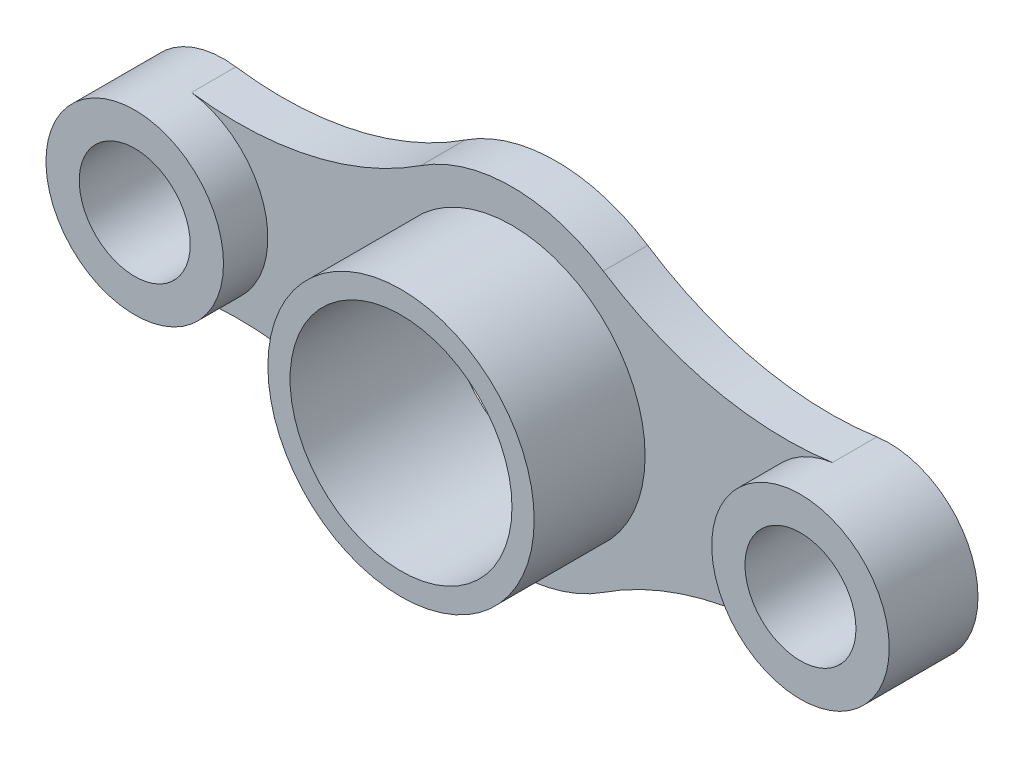
ISO-10303-21;
HEADER;
FILE_DESCRIPTION(('STEP AP214'),'2;1');
FILE_NAME('part.step','',(''),(''),'','','');
FILE_SCHEMA(('AUTOMOTIVE_DESIGN { 1 0 10303 214 1 1 1 1 }'));
ENDSEC;
DATA;
#1=APPLICATION_CONTEXT('core data for automotive mechanical design processes');
#2=APPLICATION_PROTOCOL_DEFINITION('international standard','automotive_design',2000,#1);
#3=PRODUCT_CONTEXT('',#1,'mechanical');
#4=PRODUCT('Part','Part','',(#3));
#5=PRODUCT_RELATED_PRODUCT_CATEGORY('part','',(#4));
#6=PRODUCT_DEFINITION_FORMATION('','',#4);
#7=PRODUCT_DEFINITION_CONTEXT('part definition',#1,'design');
#8=PRODUCT_DEFINITION('design','',#6,#7);
#9=PRODUCT_DEFINITION_SHAPE('','',#8);
#10=(LENGTH_UNIT() NAMED_UNIT(*) SI_UNIT(.MILLI.,.METRE.));
#11=(NAMED_UNIT(*) PLANE_ANGLE_UNIT() SI_UNIT($,.RADIAN.));
#12=(NAMED_UNIT(*) SI_UNIT($,.STERADIAN.) SOLID_ANGLE_UNIT());
#13=UNCERTAINTY_MEASURE_WITH_UNIT(LENGTH_MEASURE(1.E-05),#10,'distance_accuracy_value','');
#14=(GEOMETRIC_REPRESENTATION_CONTEXT(3) GLOBAL_UNCERTAINTY_ASSIGNED_CONTEXT((#13)) GLOBAL_UNIT_ASSIGNED_CONTEXT((#10,
#11,#12)) REPRESENTATION_CONTEXT('',''));
#15=CARTESIAN_POINT('',(0.,0.,0.));
#16=DIRECTION('',(0.,0.,1.));
#17=DIRECTION('',(1.,0.,0.));
#18=AXIS2_PLACEMENT_3D('',#15,#16,#17);
#19=CARTESIAN_POINT('',(123.416666666667,-188.131141464907,20.));
#20=DIRECTION('',(0.,0.,-1.));
#21=DIRECTION('',(-1.,0.,0.));
#22=AXIS2_PLACEMENT_3D('',#19,#20,#21);
#23=CYLINDRICAL_SURFACE('',#22,150.);
#24=CARTESIAN_POINT('',(123.416666666667,-188.131141464907,0.));
#25=DIRECTION('',(0.,0.,1.));
#26=DIRECTION('',(1.,0.,0.));
#27=AXIS2_PLACEMENT_3D('',#24,#25,#26);
#28=CIRCLE('',#27,150.);
#29=CARTESIAN_POINT('',(144.40350877193,-39.6065560978751,0.));
#30=VERTEX_POINT('',#29);
#31=CARTESIAN_POINT('',(41.1388888888889,-62.7103804883024,0.));
#32=VERTEX_POINT('',#31);
#33=EDGE_CURVE('E130',#30,#32,#28,.T.);
#34=ORIENTED_EDGE('',*,*,#33,.F.);
#35=DIRECTION('',(0.,0.,-1.));
#36=VECTOR('',#35,1.);
#37=CARTESIAN_POINT('',(144.40350877193,-39.6065560978751,20.));
#38=LINE('',#37,#36);
#39=CARTESIAN_POINT('',(144.40350877193,-39.6065560978751,20.));
#40=VERTEX_POINT('',#39);
#41=EDGE_CURVE('E11',#40,#30,#38,.T.);
#42=ORIENTED_EDGE('',*,*,#41,.F.);
#43=CARTESIAN_POINT('',(123.416666666667,-188.131141464907,20.));
#44=DIRECTION('',(0.,0.,1.));
#45=DIRECTION('',(1.,0.,0.));
#46=AXIS2_PLACEMENT_3D('',#43,#44,#45);
#47=CIRCLE('',#46,150.);
#48=CARTESIAN_POINT('',(41.1388888888889,-62.7103804883024,20.));
#49=VERTEX_POINT('',#48);
#50=EDGE_CURVE('E199',#40,#49,#47,.T.);
#51=ORIENTED_EDGE('',*,*,#50,.T.);
#52=DIRECTION('',(0.,0.,-1.));
#53=VECTOR('',#52,1.);
#54=CARTESIAN_POINT('',(41.1388888888889,-62.7103804883024,20.));
#55=LINE('',#54,#53);
#56=EDGE_CURVE('E81',#49,#32,#55,.T.);
#57=ORIENTED_EDGE('',*,*,#56,.T.);
#58=EDGE_LOOP('',(#34,#42,#51,#57));
#59=FACE_BOUND('',#58,.T.);
#60=ADVANCED_FACE('F35',(#59),#23,.F.);
#61=CARTESIAN_POINT('',(123.416666666667,188.131141464907,20.));
#62=DIRECTION('',(0.,0.,-1.));
#63=DIRECTION('',(-1.,0.,0.));
#64=AXIS2_PLACEMENT_3D('',#61,#62,#63);
#65=CYLINDRICAL_SURFACE('',#64,150.);
#66=CARTESIAN_POINT('',(123.416666666667,188.131141464907,0.));
#67=DIRECTION('',(0.,0.,1.));
#68=DIRECTION('',(1.,0.,0.));
#69=AXIS2_PLACEMENT_3D('',#66,#67,#68);
#70=CIRCLE('',#69,150.);
#71=CARTESIAN_POINT('',(144.40350877193,39.6065560978752,0.));
#72=VERTEX_POINT('',#71);
#73=CARTESIAN_POINT('',(41.1388888888889,62.7103804883023,0.));
#74=VERTEX_POINT('',#73);
#75=EDGE_CURVE('E132',#72,#74,#70,.F.);
#76=ORIENTED_EDGE('',*,*,#75,.T.);
#77=DIRECTION('',(0.,0.,-1.));
#78=VECTOR('',#77,1.);
#79=CARTESIAN_POINT('',(41.1388888888889,62.7103804883023,20.));
#80=LINE('',#79,#78);
#81=CARTESIAN_POINT('',(41.1388888888889,62.7103804883023,20.));
#82=VERTEX_POINT('',#81);
#83=EDGE_CURVE('E115',#82,#74,#80,.T.);
#84=ORIENTED_EDGE('',*,*,#83,.F.);
#85=CARTESIAN_POINT('',(123.416666666667,188.131141464907,20.));
#86=DIRECTION('',(0.,0.,1.));
#87=DIRECTION('',(1.,0.,0.));
#88=AXIS2_PLACEMENT_3D('',#85,#86,#87);
#89=CIRCLE('',#88,150.);
#90=CARTESIAN_POINT('',(144.40350877193,39.6065560978751,20.));
#91=VERTEX_POINT('',#90);
#92=EDGE_CURVE('E103',#91,#82,#89,.F.);
#93=ORIENTED_EDGE('',*,*,#92,.F.);
#94=DIRECTION('',(0.,0.,-1.));
#95=VECTOR('',#94,1.);
#96=CARTESIAN_POINT('',(144.40350877193,39.6065560978751,20.));
#97=LINE('',#96,#95);
#98=EDGE_CURVE('E43',#91,#72,#97,.T.);
#99=ORIENTED_EDGE('',*,*,#98,.T.);
#100=EDGE_LOOP('',(#76,#84,#93,#99));
#101=FACE_BOUND('',#100,.T.);
#102=ADVANCED_FACE('F156',(#101),#65,.F.);
#103=CARTESIAN_POINT('',(0.,0.,20.));
#104=DIRECTION('',(0.,0.,-1.));
#105=DIRECTION('',(-1.,0.,0.));
#106=AXIS2_PLACEMENT_3D('',#103,#104,#105);
#107=CYLINDRICAL_SURFACE('',#106,74.9999999999999);
#108=CARTESIAN_POINT('',(0.,0.,0.));
#109=DIRECTION('',(0.,0.,1.));
#110=DIRECTION('',(1.,0.,0.));
#111=AXIS2_PLACEMENT_3D('',#108,#109,#110);
#112=CIRCLE('',#111,74.9999999999999);
#113=CARTESIAN_POINT('',(-41.1388888888889,62.7103804883023,0.));
#114=VERTEX_POINT('',#113);
#115=EDGE_CURVE('E111',#74,#114,#112,.T.);
#116=ORIENTED_EDGE('',*,*,#115,.T.);
#117=DIRECTION('',(0.,0.,-1.));
#118=VECTOR('',#117,1.);
#119=CARTESIAN_POINT('',(-41.1388888888889,62.7103804883023,20.));
#120=LINE('',#119,#118);
#121=CARTESIAN_POINT('',(-41.1388888888889,62.7103804883023,20.));
#122=VERTEX_POINT('',#121);
#123=EDGE_CURVE('E109',#122,#114,#120,.T.);
#124=ORIENTED_EDGE('',*,*,#123,.F.);
#125=CARTESIAN_POINT('',(0.,0.,20.));
#126=DIRECTION('',(0.,0.,1.));
#127=DIRECTION('',(1.,0.,0.));
#128=AXIS2_PLACEMENT_3D('',#125,#126,#127);
#129=CIRCLE('',#128,74.9999999999999);
#130=EDGE_CURVE('E95',#82,#122,#129,.T.);
#131=ORIENTED_EDGE('',*,*,#130,.F.);
#132=ORIENTED_EDGE('',*,*,#83,.T.);
#133=EDGE_LOOP('',(#116,#124,#131,#132));
#134=FACE_BOUND('',#133,.T.);
#135=ADVANCED_FACE('F110',(#134),#107,.T.);
#136=CARTESIAN_POINT('',(-123.416666666667,188.131141464907,20.));
#137=DIRECTION('',(0.,0.,-1.));
#138=DIRECTION('',(-1.,0.,0.));
#139=AXIS2_PLACEMENT_3D('',#136,#137,#138);
#140=CYLINDRICAL_SURFACE('',#139,150.);
#141=CARTESIAN_POINT('',(-123.416666666667,188.131141464907,0.));
#142=DIRECTION('',(0.,0.,1.));
#143=DIRECTION('',(1.,0.,0.));
#144=AXIS2_PLACEMENT_3D('',#141,#142,#143);
#145=CIRCLE('',#144,150.);
#146=CARTESIAN_POINT('',(-144.40350877193,39.6065560978751,0.));
#147=VERTEX_POINT('',#146);
#148=EDGE_CURVE('E137',#147,#114,#145,.T.);
#149=ORIENTED_EDGE('',*,*,#148,.F.);
#150=DIRECTION('',(0.,0.,-1.));
#151=VECTOR('',#150,1.);
#152=CARTESIAN_POINT('',(-144.40350877193,39.6065560978751,20.));
#153=LINE('',#152,#151);
#154=CARTESIAN_POINT('',(-144.40350877193,39.6065560978751,20.));
#155=VERTEX_POINT('',#154);
#156=EDGE_CURVE('E116',#155,#147,#153,.T.);
#157=ORIENTED_EDGE('',*,*,#156,.F.);
#158=CARTESIAN_POINT('',(-123.416666666667,188.131141464907,20.));
#159=DIRECTION('',(0.,0.,1.));
#160=DIRECTION('',(1.,0.,0.));
#161=AXIS2_PLACEMENT_3D('',#158,#159,#160);
#162=CIRCLE('',#161,150.);
#163=EDGE_CURVE('E101',#155,#122,#162,.T.);
#164=ORIENTED_EDGE('',*,*,#163,.T.);
#165=ORIENTED_EDGE('',*,*,#123,.T.);
#166=EDGE_LOOP('',(#149,#157,#164,#165));
#167=FACE_BOUND('',#166,.T.);
#168=ADVANCED_FACE('F119',(#167),#140,.F.);
#169=CARTESIAN_POINT('',(-123.416666666667,-188.131141464907,20.));
#170=DIRECTION('',(0.,0.,-1.));
#171=DIRECTION('',(-1.,0.,0.));
#172=AXIS2_PLACEMENT_3D('',#169,#170,#171);
#173=CYLINDRICAL_SURFACE('',#172,150.);
#174=CARTESIAN_POINT('',(-123.416666666667,-188.131141464907,0.));
#175=DIRECTION('',(0.,0.,1.));
#176=DIRECTION('',(1.,0.,0.));
#177=AXIS2_PLACEMENT_3D('',#174,#175,#176);
#178=CIRCLE('',#177,150.);
#179=CARTESIAN_POINT('',(-144.40350877193,-39.606556097875,0.));
#180=VERTEX_POINT('',#179);
#181=CARTESIAN_POINT('',(-41.1388888888889,-62.7103804883023,0.));
#182=VERTEX_POINT('',#181);
#183=EDGE_CURVE('E139',#180,#182,#178,.F.);
#184=ORIENTED_EDGE('',*,*,#183,.T.);
#185=DIRECTION('',(0.,0.,-1.));
#186=VECTOR('',#185,1.);
#187=CARTESIAN_POINT('',(-41.1388888888889,-62.7103804883023,20.));
#188=LINE('',#187,#186);
#189=CARTESIAN_POINT('',(-41.1388888888889,-62.7103804883023,20.));
#190=VERTEX_POINT('',#189);
#191=EDGE_CURVE('E145',#190,#182,#188,.T.);
#192=ORIENTED_EDGE('',*,*,#191,.F.);
#193=CARTESIAN_POINT('',(-123.416666666667,-188.131141464907,20.));
#194=DIRECTION('',(0.,0.,1.));
#195=DIRECTION('',(1.,0.,0.));
#196=AXIS2_PLACEMENT_3D('',#193,#194,#195);
#197=CIRCLE('',#196,150.);
#198=CARTESIAN_POINT('',(-144.40350877193,-39.6065560978751,20.));
#199=VERTEX_POINT('',#198);
#200=EDGE_CURVE('E124',#199,#190,#197,.F.);
#201=ORIENTED_EDGE('',*,*,#200,.F.);
#202=DIRECTION('',(0.,0.,-1.));
#203=VECTOR('',#202,1.);
#204=CARTESIAN_POINT('',(-144.40350877193,-39.6065560978751,20.));
#205=LINE('',#204,#203);
#206=EDGE_CURVE('E147',#199,#180,#205,.T.);
#207=ORIENTED_EDGE('',*,*,#206,.T.);
#208=EDGE_LOOP('',(#184,#192,#201,#207));
#209=FACE_BOUND('',#208,.T.);
#210=ADVANCED_FACE('F213',(#209),#173,.F.);
#211=CARTESIAN_POINT('',(0.,0.,20.));
#212=DIRECTION('',(0.,0.,-1.));
#213=DIRECTION('',(-1.,0.,0.));
#214=AXIS2_PLACEMENT_3D('',#211,#212,#213);
#215=CYLINDRICAL_SURFACE('',#214,75.);
#216=CARTESIAN_POINT('',(0.,0.,0.));
#217=DIRECTION('',(0.,0.,1.));
#218=DIRECTION('',(1.,0.,0.));
#219=AXIS2_PLACEMENT_3D('',#216,#217,#218);
#220=CIRCLE('',#219,75.);
#221=EDGE_CURVE('E75',#182,#32,#220,.T.);
#222=ORIENTED_EDGE('',*,*,#221,.T.);
#223=ORIENTED_EDGE('',*,*,#56,.F.);
#224=CARTESIAN_POINT('',(0.,0.,20.));
#225=DIRECTION('',(0.,0.,1.));
#226=DIRECTION('',(1.,0.,0.));
#227=AXIS2_PLACEMENT_3D('',#224,#225,#226);
#228=CIRCLE('',#227,75.);
#229=EDGE_CURVE('E51',#190,#49,#228,.T.);
#230=ORIENTED_EDGE('',*,*,#229,.F.);
#231=ORIENTED_EDGE('',*,*,#191,.T.);
#232=EDGE_LOOP('',(#222,#223,#230,#231));
#233=FACE_BOUND('',#232,.T.);
#234=ADVANCED_FACE('F216',(#233),#215,.T.);
#235=CARTESIAN_POINT('',(0.,0.,20.));
#236=DIRECTION('',(0.,0.,1.));
#237=DIRECTION('',(1.,0.,0.));
#238=AXIS2_PLACEMENT_3D('',#235,#236,#237);
#239=PLANE('',#238);
#240=CARTESIAN_POINT('',(0.,0.,20.));
#241=DIRECTION('',(0.,0.,1.));
#242=DIRECTION('',(1.,0.,0.));
#243=AXIS2_PLACEMENT_3D('',#240,#241,#242);
#244=CIRCLE('',#243,60.);
#245=CARTESIAN_POINT('',(60.,0.,20.));
#246=VERTEX_POINT('',#245);
#247=EDGE_CURVE('E143',#246,#246,#244,.T.);
#248=ORIENTED_EDGE('',*,*,#247,.F.);
#249=EDGE_LOOP('',(#248));
#250=FACE_BOUND('',#249,.T.);
#251=ORIENTED_EDGE('',*,*,#50,.F.);
#252=CARTESIAN_POINT('',(150.,0.,20.));
#253=DIRECTION('',(0.,0.,1.));
#254=DIRECTION('',(1.,0.,0.));
#255=AXIS2_PLACEMENT_3D('',#252,#253,#254);
#256=CIRCLE('',#255,40.);
#257=EDGE_CURVE('E201',#40,#91,#256,.F.);
#258=ORIENTED_EDGE('',*,*,#257,.T.);
#259=ORIENTED_EDGE('',*,*,#92,.T.);
#260=ORIENTED_EDGE('',*,*,#130,.T.);
#261=ORIENTED_EDGE('',*,*,#163,.F.);
#262=CARTESIAN_POINT('',(-150.,0.,20.));
#263=DIRECTION('',(0.,0.,1.));
#264=DIRECTION('',(1.,0.,0.));
#265=AXIS2_PLACEMENT_3D('',#262,#263,#264);
#266=CIRCLE('',#265,40.);
#267=EDGE_CURVE('E121',#199,#155,#266,.T.);
#268=ORIENTED_EDGE('',*,*,#267,.F.);
#269=ORIENTED_EDGE('',*,*,#200,.T.);
#270=ORIENTED_EDGE('',*,*,#229,.T.);
#271=EDGE_LOOP('',(#251,#258,#259,#260,#261,#268,#269,#270));
#272=FACE_BOUND('',#271,.T.);
#273=ADVANCED_FACE('F97',(#250,#272),#239,.T.);
#274=CARTESIAN_POINT('',(0.,0.,0.));
#275=DIRECTION('',(0.,0.,1.));
#276=DIRECTION('',(1.,0.,0.));
#277=AXIS2_PLACEMENT_3D('',#274,#275,#276);
#278=PLANE('',#277);
#279=ORIENTED_EDGE('',*,*,#33,.T.);
#280=ORIENTED_EDGE('',*,*,#221,.F.);
#281=ORIENTED_EDGE('',*,*,#183,.F.);
#282=CARTESIAN_POINT('',(-150.,0.,0.));
#283=DIRECTION('',(0.,0.,1.));
#284=DIRECTION('',(1.,0.,0.));
#285=AXIS2_PLACEMENT_3D('',#282,#283,#284);
#286=CIRCLE('',#285,39.9999999999999);
#287=EDGE_CURVE('E181',#147,#180,#286,.T.);
#288=ORIENTED_EDGE('',*,*,#287,.F.);
#289=ORIENTED_EDGE('',*,*,#148,.T.);
#290=ORIENTED_EDGE('',*,*,#115,.F.);
#291=ORIENTED_EDGE('',*,*,#75,.F.);
#292=CARTESIAN_POINT('',(150.,0.,0.));
#293=DIRECTION('',(0.,0.,1.));
#294=DIRECTION('',(1.,0.,0.));
#295=AXIS2_PLACEMENT_3D('',#292,#293,#294);
#296=CIRCLE('',#295,40.);
#297=EDGE_CURVE('E165',#72,#30,#296,.F.);
#298=ORIENTED_EDGE('',*,*,#297,.T.);
#299=EDGE_LOOP('',(#279,#280,#281,#288,#289,#290,#291,#298));
#300=FACE_BOUND('',#299,.T.);
#301=CARTESIAN_POINT('',(0.,0.,0.));
#302=DIRECTION('',(0.,0.,1.));
#303=DIRECTION('',(1.,0.,0.));
#304=AXIS2_PLACEMENT_3D('',#301,#302,#303);
#305=CIRCLE('',#304,50.);
#306=CARTESIAN_POINT('',(50.,0.,0.));
#307=VERTEX_POINT('',#306);
#308=EDGE_CURVE('E184',#307,#307,#305,.T.);
#309=ORIENTED_EDGE('',*,*,#308,.T.);
#310=EDGE_LOOP('',(#309));
#311=FACE_BOUND('',#310,.T.);
#312=CARTESIAN_POINT('',(-150.,0.,0.));
#313=DIRECTION('',(0.,0.,1.));
#314=DIRECTION('',(1.,0.,0.));
#315=AXIS2_PLACEMENT_3D('',#312,#313,#314);
#316=CIRCLE('',#315,25.);
#317=CARTESIAN_POINT('',(-125.,0.,0.));
#318=VERTEX_POINT('',#317);
#319=EDGE_CURVE('E185',#318,#318,#316,.T.);
#320=ORIENTED_EDGE('',*,*,#319,.T.);
#321=EDGE_LOOP('',(#320));
#322=FACE_BOUND('',#321,.T.);
#323=CARTESIAN_POINT('',(150.,0.,0.));
#324=DIRECTION('',(0.,0.,1.));
#325=DIRECTION('',(1.,0.,0.));
#326=AXIS2_PLACEMENT_3D('',#323,#324,#325);
#327=CIRCLE('',#326,25.);
#328=CARTESIAN_POINT('',(175.,0.,0.));
#329=VERTEX_POINT('',#328);
#330=EDGE_CURVE('E168',#329,#329,#327,.F.);
#331=ORIENTED_EDGE('',*,*,#330,.F.);
#332=EDGE_LOOP('',(#331));
#333=FACE_BOUND('',#332,.T.);
#334=ADVANCED_FACE('F163',(#300,#311,#322,#333),#278,.F.);
#335=CARTESIAN_POINT('',(0.,0.,70.));
#336=DIRECTION('',(0.,0.,-1.));
#337=DIRECTION('',(-1.,0.,0.));
#338=AXIS2_PLACEMENT_3D('',#335,#336,#337);
#339=CYLINDRICAL_SURFACE('',#338,50.);
#340=CARTESIAN_POINT('',(0.,0.,70.));
#341=DIRECTION('',(0.,0.,1.));
#342=DIRECTION('',(1.,0.,0.));
#343=AXIS2_PLACEMENT_3D('',#340,#341,#342);
#344=CIRCLE('',#343,50.);
#345=CARTESIAN_POINT('',(50.,0.,70.));
#346=VERTEX_POINT('',#345);
#347=EDGE_CURVE('E190',#346,#346,#344,.T.);
#348=ORIENTED_EDGE('',*,*,#347,.T.);
#349=EDGE_LOOP('',(#348));
#350=FACE_BOUND('',#349,.T.);
#351=ORIENTED_EDGE('',*,*,#308,.F.);
#352=EDGE_LOOP('',(#351));
#353=FACE_BOUND('',#352,.T.);
#354=ADVANCED_FACE('F223',(#350,#353),#339,.F.);
#355=CARTESIAN_POINT('',(0.,0.,70.));
#356=DIRECTION('',(0.,0.,-1.));
#357=DIRECTION('',(-1.,0.,0.));
#358=AXIS2_PLACEMENT_3D('',#355,#356,#357);
#359=CYLINDRICAL_SURFACE('',#358,60.);
#360=ORIENTED_EDGE('',*,*,#247,.T.);
#361=EDGE_LOOP('',(#360));
#362=FACE_BOUND('',#361,.T.);
#363=CARTESIAN_POINT('',(0.,0.,70.));
#364=DIRECTION('',(0.,0.,1.));
#365=DIRECTION('',(1.,0.,0.));
#366=AXIS2_PLACEMENT_3D('',#363,#364,#365);
#367=CIRCLE('',#366,60.);
#368=CARTESIAN_POINT('',(60.,0.,70.));
#369=VERTEX_POINT('',#368);
#370=EDGE_CURVE('E133',#369,#369,#367,.T.);
#371=ORIENTED_EDGE('',*,*,#370,.F.);
#372=EDGE_LOOP('',(#371));
#373=FACE_BOUND('',#372,.T.);
#374=ADVANCED_FACE('F229',(#362,#373),#359,.T.);
#375=CARTESIAN_POINT('',(0.,0.,70.));
#376=DIRECTION('',(0.,0.,1.));
#377=DIRECTION('',(1.,0.,0.));
#378=AXIS2_PLACEMENT_3D('',#375,#376,#377);
#379=PLANE('',#378);
#380=ORIENTED_EDGE('',*,*,#347,.F.);
#381=EDGE_LOOP('',(#380));
#382=FACE_BOUND('',#381,.T.);
#383=ORIENTED_EDGE('',*,*,#370,.T.);
#384=EDGE_LOOP('',(#383));
#385=FACE_BOUND('',#384,.T.);
#386=ADVANCED_FACE('F233',(#382,#385),#379,.T.);
#387=CARTESIAN_POINT('',(-150.,0.,40.));
#388=DIRECTION('',(0.,0.,-1.));
#389=DIRECTION('',(-1.,0.,0.));
#390=AXIS2_PLACEMENT_3D('',#387,#388,#389);
#391=CYLINDRICAL_SURFACE('',#390,39.9999999999999);
#392=CARTESIAN_POINT('',(-150.,0.,40.));
#393=DIRECTION('',(0.,0.,1.));
#394=DIRECTION('',(1.,0.,0.));
#395=AXIS2_PLACEMENT_3D('',#392,#393,#394);
#396=CIRCLE('',#395,39.9999999999999);
#397=CARTESIAN_POINT('',(-110.,0.,40.));
#398=VERTEX_POINT('',#397);
#399=EDGE_CURVE('E180',#398,#398,#396,.T.);
#400=ORIENTED_EDGE('',*,*,#399,.F.);
#401=EDGE_LOOP('',(#400));
#402=FACE_BOUND('',#401,.T.);
#403=ORIENTED_EDGE('',*,*,#267,.T.);
#404=ORIENTED_EDGE('',*,*,#156,.T.);
#405=ORIENTED_EDGE('',*,*,#287,.T.);
#406=ORIENTED_EDGE('',*,*,#206,.F.);
#407=EDGE_LOOP('',(#403,#404,#405,#406));
#408=FACE_BOUND('',#407,.T.);
#409=ADVANCED_FACE('F237',(#402,#408),#391,.T.);
#410=CARTESIAN_POINT('',(-150.,0.,40.));
#411=DIRECTION('',(0.,0.,-1.));
#412=DIRECTION('',(-1.,0.,0.));
#413=AXIS2_PLACEMENT_3D('',#410,#411,#412);
#414=CYLINDRICAL_SURFACE('',#413,25.);
#415=CARTESIAN_POINT('',(-150.,0.,40.));
#416=DIRECTION('',(0.,0.,1.));
#417=DIRECTION('',(1.,0.,0.));
#418=AXIS2_PLACEMENT_3D('',#415,#416,#417);
#419=CIRCLE('',#418,25.);
#420=CARTESIAN_POINT('',(-125.,0.,40.));
#421=VERTEX_POINT('',#420);
#422=EDGE_CURVE('E177',#421,#421,#419,.T.);
#423=ORIENTED_EDGE('',*,*,#422,.T.);
#424=EDGE_LOOP('',(#423));
#425=FACE_BOUND('',#424,.T.);
#426=ORIENTED_EDGE('',*,*,#319,.F.);
#427=EDGE_LOOP('',(#426));
#428=FACE_BOUND('',#427,.T.);
#429=ADVANCED_FACE('F239',(#425,#428),#414,.F.);
#430=CARTESIAN_POINT('',(0.,0.,40.));
#431=DIRECTION('',(0.,0.,1.));
#432=DIRECTION('',(1.,0.,0.));
#433=AXIS2_PLACEMENT_3D('',#430,#431,#432);
#434=PLANE('',#433);
#435=ORIENTED_EDGE('',*,*,#422,.F.);
#436=EDGE_LOOP('',(#435));
#437=FACE_BOUND('',#436,.T.);
#438=ORIENTED_EDGE('',*,*,#399,.T.);
#439=EDGE_LOOP('',(#438));
#440=FACE_BOUND('',#439,.T.);
#441=ADVANCED_FACE('F242',(#437,#440),#434,.T.);
#442=CARTESIAN_POINT('',(150.,0.,40.));
#443=DIRECTION('',(0.,0.,-1.));
#444=DIRECTION('',(-1.,0.,0.));
#445=AXIS2_PLACEMENT_3D('',#442,#443,#444);
#446=CYLINDRICAL_SURFACE('',#445,40.);
#447=ORIENTED_EDGE('',*,*,#257,.F.);
#448=ORIENTED_EDGE('',*,*,#41,.T.);
#449=ORIENTED_EDGE('',*,*,#297,.F.);
#450=ORIENTED_EDGE('',*,*,#98,.F.);
#451=EDGE_LOOP('',(#447,#448,#449,#450));
#452=FACE_BOUND('',#451,.T.);
#453=CARTESIAN_POINT('',(150.,0.,40.));
#454=DIRECTION('',(0.,0.,1.));
#455=DIRECTION('',(1.,0.,0.));
#456=AXIS2_PLACEMENT_3D('',#453,#454,#455);
#457=CIRCLE('',#456,40.);
#458=CARTESIAN_POINT('',(190.,0.,40.));
#459=VERTEX_POINT('',#458);
#460=EDGE_CURVE('E171',#459,#459,#457,.F.);
#461=ORIENTED_EDGE('',*,*,#460,.T.);
#462=EDGE_LOOP('',(#461));
#463=FACE_BOUND('',#462,.T.);
#464=ADVANCED_FACE('F166',(#452,#463),#446,.T.);
#465=CARTESIAN_POINT('',(150.,0.,40.));
#466=DIRECTION('',(0.,0.,-1.));
#467=DIRECTION('',(-1.,0.,0.));
#468=AXIS2_PLACEMENT_3D('',#465,#466,#467);
#469=CYLINDRICAL_SURFACE('',#468,25.);
#470=CARTESIAN_POINT('',(150.,0.,40.));
#471=DIRECTION('',(0.,0.,1.));
#472=DIRECTION('',(1.,0.,0.));
#473=AXIS2_PLACEMENT_3D('',#470,#471,#472);
#474=CIRCLE('',#473,25.);
#475=CARTESIAN_POINT('',(175.,0.,40.));
#476=VERTEX_POINT('',#475);
#477=EDGE_CURVE('E174',#476,#476,#474,.F.);
#478=ORIENTED_EDGE('',*,*,#477,.F.);
#479=EDGE_LOOP('',(#478));
#480=FACE_BOUND('',#479,.T.);
#481=ORIENTED_EDGE('',*,*,#330,.T.);
#482=EDGE_LOOP('',(#481));
#483=FACE_BOUND('',#482,.T.);
#484=ADVANCED_FACE('F252',(#480,#483),#469,.F.);
#485=CARTESIAN_POINT('',(0.,0.,40.));
#486=DIRECTION('',(0.,0.,1.));
#487=DIRECTION('',(1.,0.,0.));
#488=AXIS2_PLACEMENT_3D('',#485,#486,#487);
#489=PLANE('',#488);
#490=ORIENTED_EDGE('',*,*,#460,.F.);
#491=EDGE_LOOP('',(#490));
#492=FACE_BOUND('',#491,.T.);
#493=ORIENTED_EDGE('',*,*,#477,.T.);
#494=EDGE_LOOP('',(#493));
#495=FACE_BOUND('',#494,.T.);
#496=ADVANCED_FACE('F255',(#492,#495),#489,.T.);
#497=CLOSED_SHELL('',(#60,#102,#135,#168,#210,#234,#273,#334,#354,#374,#386,#409,#429,#441,#464,
#484,#496));
#498=MANIFOLD_SOLID_BREP('B2',#497);
#499=ADVANCED_BREP_SHAPE_REPRESENTATION('',(#18,#498),#14);
#500=SHAPE_DEFINITION_REPRESENTATION(#9,#499);
ENDSEC;
END-ISO-10303-21;
